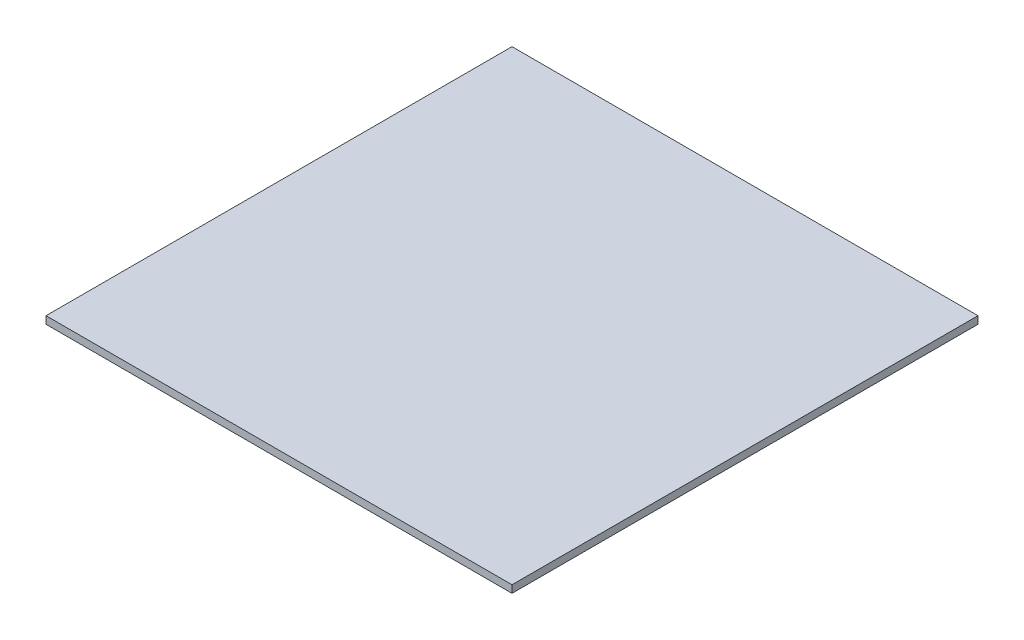
ISO-10303-21;
HEADER;
FILE_DESCRIPTION(('STEP AP214'),'2;1');
FILE_NAME('part.step','',(''),(''),'','','');
FILE_SCHEMA(('AUTOMOTIVE_DESIGN { 1 0 10303 214 1 1 1 1 }'));
ENDSEC;
DATA;
#1=APPLICATION_CONTEXT('core data for automotive mechanical design processes');
#2=APPLICATION_PROTOCOL_DEFINITION('international standard','automotive_design',2000,#1);
#3=PRODUCT_CONTEXT('',#1,'mechanical');
#4=PRODUCT('Part','Part','',(#3));
#5=PRODUCT_RELATED_PRODUCT_CATEGORY('part','',(#4));
#6=PRODUCT_DEFINITION_FORMATION('','',#4);
#7=PRODUCT_DEFINITION_CONTEXT('part definition',#1,'design');
#8=PRODUCT_DEFINITION('design','',#6,#7);
#9=PRODUCT_DEFINITION_SHAPE('','',#8);
#10=(LENGTH_UNIT() NAMED_UNIT(*) SI_UNIT(.MILLI.,.METRE.));
#11=(NAMED_UNIT(*) PLANE_ANGLE_UNIT() SI_UNIT($,.RADIAN.));
#12=(NAMED_UNIT(*) SI_UNIT($,.STERADIAN.) SOLID_ANGLE_UNIT());
#13=UNCERTAINTY_MEASURE_WITH_UNIT(LENGTH_MEASURE(1.E-05),#10,'distance_accuracy_value','');
#14=(GEOMETRIC_REPRESENTATION_CONTEXT(3) GLOBAL_UNCERTAINTY_ASSIGNED_CONTEXT((#13)) GLOBAL_UNIT_ASSIGNED_CONTEXT((#10,
#11,#12)) REPRESENTATION_CONTEXT('',''));
#15=CARTESIAN_POINT('',(0.,0.,0.));
#16=DIRECTION('',(0.,0.,1.));
#17=DIRECTION('',(1.,0.,0.));
#18=AXIS2_PLACEMENT_3D('',#15,#16,#17);
#19=CARTESIAN_POINT('',(50.,1.6,50.));
#20=DIRECTION('',(-1.,0.,0.));
#21=DIRECTION('',(0.,0.,1.));
#22=AXIS2_PLACEMENT_3D('',#19,#20,#21);
#23=PLANE('',#22);
#24=DIRECTION('',(0.,0.,-1.));
#25=VECTOR('',#24,1.);
#26=CARTESIAN_POINT('',(50.,0.,50.));
#27=LINE('',#26,#25);
#28=CARTESIAN_POINT('',(50.,0.,50.));
#29=VERTEX_POINT('',#28);
#30=CARTESIAN_POINT('',(50.,0.,-50.));
#31=VERTEX_POINT('',#30);
#32=EDGE_CURVE('E96',#29,#31,#27,.T.);
#33=ORIENTED_EDGE('',*,*,#32,.T.);
#34=DIRECTION('',(0.,-1.,0.));
#35=VECTOR('',#34,1.);
#36=CARTESIAN_POINT('',(50.,1.6,-50.));
#37=LINE('',#36,#35);
#38=CARTESIAN_POINT('',(50.,1.6,-50.));
#39=VERTEX_POINT('',#38);
#40=EDGE_CURVE('E11',#39,#31,#37,.T.);
#41=ORIENTED_EDGE('',*,*,#40,.F.);
#42=DIRECTION('',(0.,0.,-1.));
#43=VECTOR('',#42,1.);
#44=CARTESIAN_POINT('',(50.,1.6,50.));
#45=LINE('',#44,#43);
#46=CARTESIAN_POINT('',(50.,1.6,50.));
#47=VERTEX_POINT('',#46);
#48=EDGE_CURVE('E84',#47,#39,#45,.T.);
#49=ORIENTED_EDGE('',*,*,#48,.F.);
#50=DIRECTION('',(0.,-1.,0.));
#51=VECTOR('',#50,1.);
#52=CARTESIAN_POINT('',(50.,1.6,50.));
#53=LINE('',#52,#51);
#54=EDGE_CURVE('E92',#47,#29,#53,.T.);
#55=ORIENTED_EDGE('',*,*,#54,.T.);
#56=EDGE_LOOP('',(#33,#41,#49,#55));
#57=FACE_BOUND('',#56,.T.);
#58=ADVANCED_FACE('F33',(#57),#23,.F.);
#59=CARTESIAN_POINT('',(-50.,1.6,-50.));
#60=DIRECTION('',(0.,0.,1.));
#61=DIRECTION('',(1.,0.,0.));
#62=AXIS2_PLACEMENT_3D('',#59,#60,#61);
#63=PLANE('',#62);
#64=DIRECTION('',(-1.,0.,0.));
#65=VECTOR('',#64,1.);
#66=CARTESIAN_POINT('',(-50.,0.,-50.));
#67=LINE('',#66,#65);
#68=CARTESIAN_POINT('',(-50.,0.,-50.));
#69=VERTEX_POINT('',#68);
#70=EDGE_CURVE('E88',#31,#69,#67,.T.);
#71=ORIENTED_EDGE('',*,*,#70,.T.);
#72=DIRECTION('',(0.,-1.,0.));
#73=VECTOR('',#72,1.);
#74=CARTESIAN_POINT('',(-50.,1.6,-50.));
#75=LINE('',#74,#73);
#76=CARTESIAN_POINT('',(-50.,1.6,-50.));
#77=VERTEX_POINT('',#76);
#78=EDGE_CURVE('E41',#77,#69,#75,.T.);
#79=ORIENTED_EDGE('',*,*,#78,.F.);
#80=DIRECTION('',(-1.,0.,0.));
#81=VECTOR('',#80,1.);
#82=CARTESIAN_POINT('',(-50.,1.6,-50.));
#83=LINE('',#82,#81);
#84=EDGE_CURVE('E79',#39,#77,#83,.T.);
#85=ORIENTED_EDGE('',*,*,#84,.F.);
#86=ORIENTED_EDGE('',*,*,#40,.T.);
#87=EDGE_LOOP('',(#71,#79,#85,#86));
#88=FACE_BOUND('',#87,.T.);
#89=ADVANCED_FACE('F87',(#88),#63,.F.);
#90=CARTESIAN_POINT('',(-50.,1.6,50.));
#91=DIRECTION('',(1.,0.,0.));
#92=DIRECTION('',(0.,0.,-1.));
#93=AXIS2_PLACEMENT_3D('',#90,#91,#92);
#94=PLANE('',#93);
#95=DIRECTION('',(0.,0.,1.));
#96=VECTOR('',#95,1.);
#97=CARTESIAN_POINT('',(-50.,0.,50.));
#98=LINE('',#97,#96);
#99=CARTESIAN_POINT('',(-50.,0.,50.));
#100=VERTEX_POINT('',#99);
#101=EDGE_CURVE('E66',#69,#100,#98,.T.);
#102=ORIENTED_EDGE('',*,*,#101,.T.);
#103=DIRECTION('',(0.,-1.,0.));
#104=VECTOR('',#103,1.);
#105=CARTESIAN_POINT('',(-50.,1.6,50.));
#106=LINE('',#105,#104);
#107=CARTESIAN_POINT('',(-50.,1.6,50.));
#108=VERTEX_POINT('',#107);
#109=EDGE_CURVE('E89',#108,#100,#106,.T.);
#110=ORIENTED_EDGE('',*,*,#109,.F.);
#111=DIRECTION('',(0.,0.,1.));
#112=VECTOR('',#111,1.);
#113=CARTESIAN_POINT('',(-50.,1.6,50.));
#114=LINE('',#113,#112);
#115=EDGE_CURVE('E82',#77,#108,#114,.T.);
#116=ORIENTED_EDGE('',*,*,#115,.F.);
#117=ORIENTED_EDGE('',*,*,#78,.T.);
#118=EDGE_LOOP('',(#102,#110,#116,#117));
#119=FACE_BOUND('',#118,.T.);
#120=ADVANCED_FACE('F90',(#119),#94,.F.);
#121=CARTESIAN_POINT('',(-50.,1.6,50.));
#122=DIRECTION('',(0.,0.,-1.));
#123=DIRECTION('',(-1.,0.,0.));
#124=AXIS2_PLACEMENT_3D('',#121,#122,#123);
#125=PLANE('',#124);
#126=DIRECTION('',(1.,0.,0.));
#127=VECTOR('',#126,1.);
#128=CARTESIAN_POINT('',(-50.,0.,50.));
#129=LINE('',#128,#127);
#130=EDGE_CURVE('E72',#100,#29,#129,.T.);
#131=ORIENTED_EDGE('',*,*,#130,.T.);
#132=ORIENTED_EDGE('',*,*,#54,.F.);
#133=DIRECTION('',(1.,0.,0.));
#134=VECTOR('',#133,1.);
#135=CARTESIAN_POINT('',(-50.,1.6,50.));
#136=LINE('',#135,#134);
#137=EDGE_CURVE('E49',#108,#47,#136,.T.);
#138=ORIENTED_EDGE('',*,*,#137,.F.);
#139=ORIENTED_EDGE('',*,*,#109,.T.);
#140=EDGE_LOOP('',(#131,#132,#138,#139));
#141=FACE_BOUND('',#140,.T.);
#142=ADVANCED_FACE('F103',(#141),#125,.F.);
#143=CARTESIAN_POINT('',(0.,1.6,0.));
#144=DIRECTION('',(0.,-1.,0.));
#145=DIRECTION('',(0.,0.,-1.));
#146=AXIS2_PLACEMENT_3D('',#143,#144,#145);
#147=PLANE('',#146);
#148=ORIENTED_EDGE('',*,*,#48,.T.);
#149=ORIENTED_EDGE('',*,*,#84,.T.);
#150=ORIENTED_EDGE('',*,*,#115,.T.);
#151=ORIENTED_EDGE('',*,*,#137,.T.);
#152=EDGE_LOOP('',(#148,#149,#150,#151));
#153=FACE_BOUND('',#152,.T.);
#154=ADVANCED_FACE('F80',(#153),#147,.F.);
#155=CARTESIAN_POINT('',(0.,0.,0.));
#156=DIRECTION('',(0.,-1.,0.));
#157=DIRECTION('',(0.,0.,-1.));
#158=AXIS2_PLACEMENT_3D('',#155,#156,#157);
#159=PLANE('',#158);
#160=ORIENTED_EDGE('',*,*,#32,.F.);
#161=ORIENTED_EDGE('',*,*,#130,.F.);
#162=ORIENTED_EDGE('',*,*,#101,.F.);
#163=ORIENTED_EDGE('',*,*,#70,.F.);
#164=EDGE_LOOP('',(#160,#161,#162,#163));
#165=FACE_BOUND('',#164,.T.);
#166=ADVANCED_FACE('F106',(#165),#159,.T.);
#167=CLOSED_SHELL('',(#58,#89,#120,#142,#154,#166));
#168=MANIFOLD_SOLID_BREP('B2',#167);
#169=ADVANCED_BREP_SHAPE_REPRESENTATION('',(#18,#168),#14);
#170=SHAPE_DEFINITION_REPRESENTATION(#9,#169);
ENDSEC;
END-ISO-10303-21;
